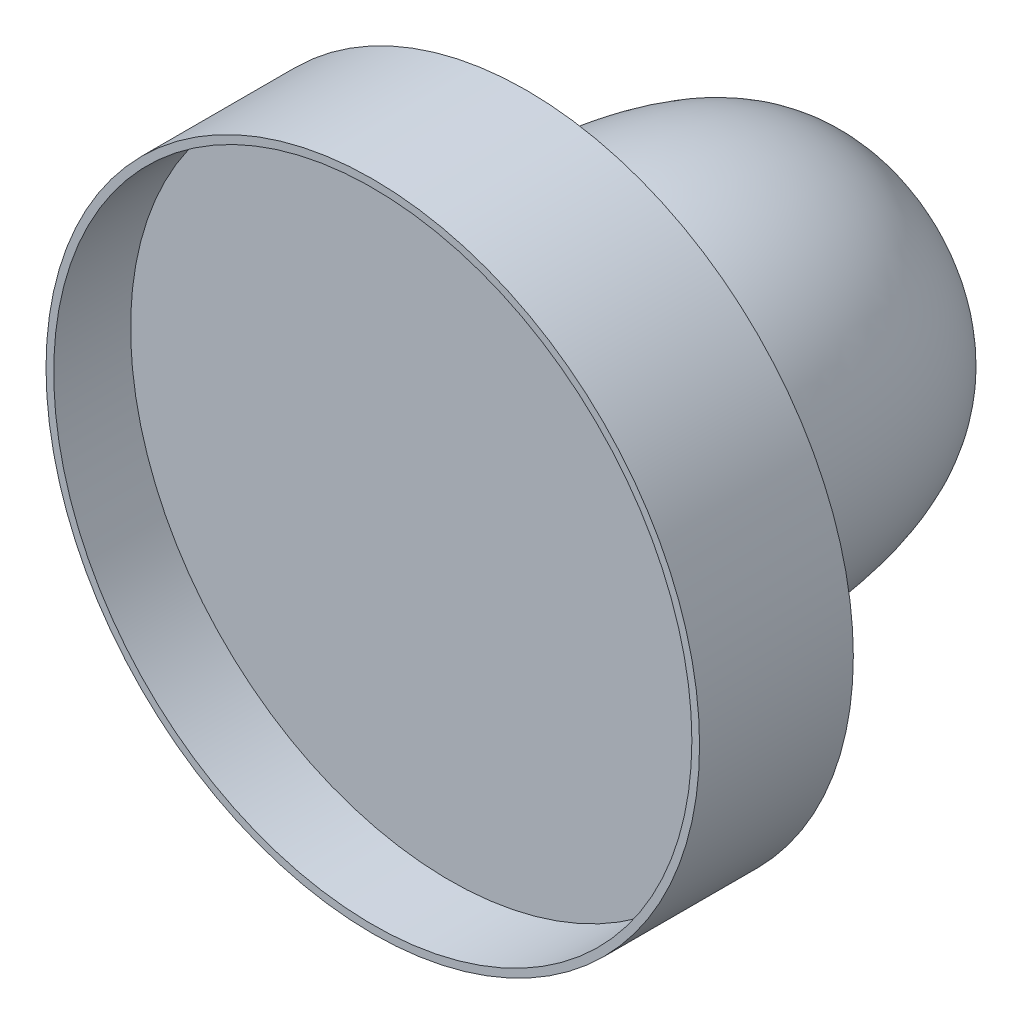
ISO-10303-21;
HEADER;
FILE_DESCRIPTION(('STEP AP214'),'2;1');
FILE_NAME('part.step','',(''),(''),'','','');
FILE_SCHEMA(('AUTOMOTIVE_DESIGN { 1 0 10303 214 1 1 1 1 }'));
ENDSEC;
DATA;
#1=APPLICATION_CONTEXT('core data for automotive mechanical design processes');
#2=APPLICATION_PROTOCOL_DEFINITION('international standard','automotive_design',2000,#1);
#3=PRODUCT_CONTEXT('',#1,'mechanical');
#4=PRODUCT('Part','Part','',(#3));
#5=PRODUCT_RELATED_PRODUCT_CATEGORY('part','',(#4));
#6=PRODUCT_DEFINITION_FORMATION('','',#4);
#7=PRODUCT_DEFINITION_CONTEXT('part definition',#1,'design');
#8=PRODUCT_DEFINITION('design','',#6,#7);
#9=PRODUCT_DEFINITION_SHAPE('','',#8);
#10=(LENGTH_UNIT() NAMED_UNIT(*) SI_UNIT(.MILLI.,.METRE.));
#11=(NAMED_UNIT(*) PLANE_ANGLE_UNIT() SI_UNIT($,.RADIAN.));
#12=(NAMED_UNIT(*) SI_UNIT($,.STERADIAN.) SOLID_ANGLE_UNIT());
#13=UNCERTAINTY_MEASURE_WITH_UNIT(LENGTH_MEASURE(1.E-05),#10,'distance_accuracy_value','');
#14=(GEOMETRIC_REPRESENTATION_CONTEXT(3) GLOBAL_UNCERTAINTY_ASSIGNED_CONTEXT((#13)) GLOBAL_UNIT_ASSIGNED_CONTEXT((#10,
#11,#12)) REPRESENTATION_CONTEXT('',''));
#15=CARTESIAN_POINT('',(0.,0.,0.));
#16=DIRECTION('',(0.,0.,1.));
#17=DIRECTION('',(1.,0.,0.));
#18=AXIS2_PLACEMENT_3D('',#15,#16,#17);
#19=CARTESIAN_POINT('',(0.,0.,0.));
#20=DIRECTION('',(0.,0.,-1.));
#21=DIRECTION('',(-1.,0.,0.));
#22=AXIS2_PLACEMENT_3D('',#19,#20,#21);
#23=PLANE('',#22);
#24=CARTESIAN_POINT('',(0.,0.,0.));
#25=DIRECTION('',(0.,0.,1.));
#26=DIRECTION('',(1.,0.,0.));
#27=AXIS2_PLACEMENT_3D('',#24,#25,#26);
#28=CIRCLE('',#27,4.15);
#29=CARTESIAN_POINT('',(4.15,0.,0.));
#30=VERTEX_POINT('',#29);
#31=EDGE_CURVE('E59',#30,#30,#28,.T.);
#32=ORIENTED_EDGE('',*,*,#31,.F.);
#33=EDGE_LOOP('',(#32));
#34=FACE_BOUND('',#33,.T.);
#35=CARTESIAN_POINT('',(0.,0.,0.));
#36=DIRECTION('',(0.,0.,-1.));
#37=DIRECTION('',(-1.,0.,0.));
#38=AXIS2_PLACEMENT_3D('',#35,#36,#37);
#39=CIRCLE('',#38,4.25);
#40=CARTESIAN_POINT('',(-4.25,0.,0.));
#41=VERTEX_POINT('',#40);
#42=EDGE_CURVE('E11',#41,#41,#39,.T.);
#43=ORIENTED_EDGE('',*,*,#42,.F.);
#44=EDGE_LOOP('',(#43));
#45=FACE_BOUND('',#44,.T.);
#46=ADVANCED_FACE('F36',(#34,#45),#23,.F.);
#47=CARTESIAN_POINT('',(0.,0.,-6.5));
#48=DIRECTION('',(0.,0.,-1.));
#49=DIRECTION('',(-1.,0.,0.));
#50=AXIS2_PLACEMENT_3D('',#47,#48,#49);
#51=CYLINDRICAL_SURFACE('',#50,4.25);
#52=CARTESIAN_POINT('',(0.,0.,-2.));
#53=DIRECTION('',(0.,0.,-1.));
#54=DIRECTION('',(-1.,0.,0.));
#55=AXIS2_PLACEMENT_3D('',#52,#53,#54);
#56=CIRCLE('',#55,4.25);
#57=CARTESIAN_POINT('',(-4.25,0.,-2.));
#58=VERTEX_POINT('',#57);
#59=EDGE_CURVE('E42',#58,#58,#56,.T.);
#60=ORIENTED_EDGE('',*,*,#59,.F.);
#61=EDGE_LOOP('',(#60));
#62=FACE_BOUND('',#61,.T.);
#63=ORIENTED_EDGE('',*,*,#42,.T.);
#64=EDGE_LOOP('',(#63));
#65=FACE_BOUND('',#64,.T.);
#66=ADVANCED_FACE('F73',(#62,#65),#51,.T.);
#67=CARTESIAN_POINT('',(2.56988592926029,0.,-2.));
#68=DIRECTION('',(0.,0.,1.));
#69=DIRECTION('',(1.,0.,0.));
#70=AXIS2_PLACEMENT_3D('',#67,#68,#69);
#71=PLANE('',#70);
#72=CARTESIAN_POINT('',(0.,0.,-2.));
#73=DIRECTION('',(0.,0.,-1.));
#74=DIRECTION('',(-1.,0.,0.));
#75=AXIS2_PLACEMENT_3D('',#72,#73,#74);
#76=CIRCLE('',#75,2.56988592926029);
#77=CARTESIAN_POINT('',(-2.56988592926029,0.,-2.));
#78=VERTEX_POINT('',#77);
#79=EDGE_CURVE('E53',#78,#78,#76,.T.);
#80=ORIENTED_EDGE('',*,*,#79,.F.);
#81=EDGE_LOOP('',(#80));
#82=FACE_BOUND('',#81,.T.);
#83=ORIENTED_EDGE('',*,*,#59,.T.);
#84=EDGE_LOOP('',(#83));
#85=FACE_BOUND('',#84,.T.);
#86=ADVANCED_FACE('F49',(#82,#85),#71,.F.);
#87=CARTESIAN_POINT('',(2.56988592926029,0.,-2.));
#88=CARTESIAN_POINT('',(2.5752533757564,0.,-4.02671370709907));
#89=CARTESIAN_POINT('',(2.68085857850083,0.,-6.94126272258438));
#90=CARTESIAN_POINT('',(0.,0.,-6.5));
#91=B_SPLINE_CURVE_WITH_KNOTS('',3,(#87,#88,#89,#90),.UNSPECIFIED.,.F.,.F.,(4,4),(0.,
0.962492363472799),.UNSPECIFIED.);
#92=CARTESIAN_POINT('',(0.,0.,-6.5));
#93=DIRECTION('',(0.,0.,-1.));
#94=AXIS1_PLACEMENT('',#92,#93);
#95=SURFACE_OF_REVOLUTION('',#91,#94);
#96=CARTESIAN_POINT('',(0.,0.,-6.5));
#97=VERTEX_POINT('',#96);
#98=VERTEX_LOOP('',#97);
#99=FACE_BOUND('',#98,.T.);
#100=ORIENTED_EDGE('',*,*,#79,.T.);
#101=EDGE_LOOP('',(#100));
#102=FACE_BOUND('',#101,.T.);
#103=ADVANCED_FACE('F45',(#99,#102),#95,.T.);
#104=CARTESIAN_POINT('',(0.,0.,-1.));
#105=DIRECTION('',(0.,0.,1.));
#106=DIRECTION('',(1.,0.,0.));
#107=AXIS2_PLACEMENT_3D('',#104,#105,#106);
#108=CYLINDRICAL_SURFACE('',#107,4.15);
#109=CARTESIAN_POINT('',(0.,0.,-1.));
#110=DIRECTION('',(0.,0.,1.));
#111=DIRECTION('',(1.,0.,0.));
#112=AXIS2_PLACEMENT_3D('',#109,#110,#111);
#113=CIRCLE('',#112,4.15);
#114=CARTESIAN_POINT('',(4.15,0.,-1.));
#115=VERTEX_POINT('',#114);
#116=EDGE_CURVE('E55',#115,#115,#113,.T.);
#117=ORIENTED_EDGE('',*,*,#116,.F.);
#118=EDGE_LOOP('',(#117));
#119=FACE_BOUND('',#118,.T.);
#120=ORIENTED_EDGE('',*,*,#31,.T.);
#121=EDGE_LOOP('',(#120));
#122=FACE_BOUND('',#121,.T.);
#123=ADVANCED_FACE('F48',(#119,#122),#108,.F.);
#124=CARTESIAN_POINT('',(0.,0.,-1.));
#125=DIRECTION('',(0.,0.,1.));
#126=DIRECTION('',(1.,0.,0.));
#127=AXIS2_PLACEMENT_3D('',#124,#125,#126);
#128=PLANE('',#127);
#129=ORIENTED_EDGE('',*,*,#116,.T.);
#130=EDGE_LOOP('',(#129));
#131=FACE_BOUND('',#130,.T.);
#132=ADVANCED_FACE('F91',(#131),#128,.T.);
#133=CLOSED_SHELL('',(#46,#66,#86,#103,#123,#132));
#134=MANIFOLD_SOLID_BREP('B2',#133);
#135=ADVANCED_BREP_SHAPE_REPRESENTATION('',(#18,#134),#14);
#136=SHAPE_DEFINITION_REPRESENTATION(#9,#135);
ENDSEC;
END-ISO-10303-21;
